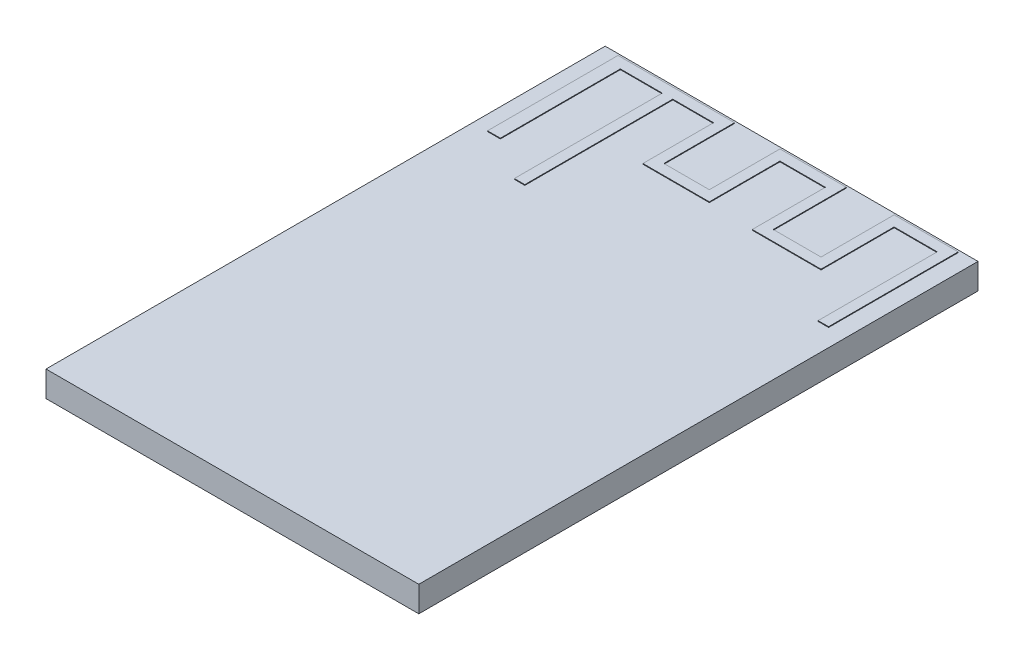
ISO-10303-21;
HEADER;
FILE_DESCRIPTION(('STEP AP214'),'2;1');
FILE_NAME('part.step','',(''),(''),'','','');
FILE_SCHEMA(('AUTOMOTIVE_DESIGN { 1 0 10303 214 1 1 1 1 }'));
ENDSEC;
DATA;
#1=APPLICATION_CONTEXT('core data for automotive mechanical design processes');
#2=APPLICATION_PROTOCOL_DEFINITION('international standard','automotive_design',2000,#1);
#3=PRODUCT_CONTEXT('',#1,'mechanical');
#4=PRODUCT('Part','Part','',(#3));
#5=PRODUCT_RELATED_PRODUCT_CATEGORY('part','',(#4));
#6=PRODUCT_DEFINITION_FORMATION('','',#4);
#7=PRODUCT_DEFINITION_CONTEXT('part definition',#1,'design');
#8=PRODUCT_DEFINITION('design','',#6,#7);
#9=PRODUCT_DEFINITION_SHAPE('','',#8);
#10=(LENGTH_UNIT() NAMED_UNIT(*) SI_UNIT(.MILLI.,.METRE.));
#11=(NAMED_UNIT(*) PLANE_ANGLE_UNIT() SI_UNIT($,.RADIAN.));
#12=(NAMED_UNIT(*) SI_UNIT($,.STERADIAN.) SOLID_ANGLE_UNIT());
#13=UNCERTAINTY_MEASURE_WITH_UNIT(LENGTH_MEASURE(1.E-05),#10,'distance_accuracy_value','');
#14=(GEOMETRIC_REPRESENTATION_CONTEXT(3) GLOBAL_UNCERTAINTY_ASSIGNED_CONTEXT((#13)) GLOBAL_UNIT_ASSIGNED_CONTEXT((#10,
#11,#12)) REPRESENTATION_CONTEXT('',''));
#15=CARTESIAN_POINT('',(0.,0.,0.));
#16=DIRECTION('',(0.,0.,1.));
#17=DIRECTION('',(1.,0.,0.));
#18=AXIS2_PLACEMENT_3D('',#15,#16,#17);
#19=CARTESIAN_POINT('',(0.,2.63,0.));
#20=DIRECTION('',(0.,-1.,0.));
#21=DIRECTION('',(0.,0.,-1.));
#22=AXIS2_PLACEMENT_3D('',#19,#20,#21);
#23=PLANE('',#22);
#24=DIRECTION('',(1.,0.,0.));
#25=VECTOR('',#24,1.);
#26=CARTESIAN_POINT('',(-19.7,2.63,-28.75));
#27=LINE('',#26,#25);
#28=CARTESIAN_POINT('',(-20.25,2.63,-28.75));
#29=VERTEX_POINT('',#28);
#30=CARTESIAN_POINT('',(-19.7,2.63,-28.75));
#31=VERTEX_POINT('',#30);
#32=EDGE_CURVE('E508',#29,#31,#27,.T.);
#33=ORIENTED_EDGE('',*,*,#32,.T.);
#34=DIRECTION('',(0.,0.,-1.));
#35=VECTOR('',#34,1.);
#36=CARTESIAN_POINT('',(-19.7,2.63,-33.9));
#37=LINE('',#36,#35);
#38=CARTESIAN_POINT('',(-19.7,2.63,-33.9));
#39=VERTEX_POINT('',#38);
#40=EDGE_CURVE('E305',#31,#39,#37,.T.);
#41=ORIENTED_EDGE('',*,*,#40,.T.);
#42=DIRECTION('',(1.,0.,0.));
#43=VECTOR('',#42,1.);
#44=CARTESIAN_POINT('',(-17.9,2.63,-33.9));
#45=LINE('',#44,#43);
#46=CARTESIAN_POINT('',(-17.9,2.63,-33.9));
#47=VERTEX_POINT('',#46);
#48=EDGE_CURVE('E300',#39,#47,#45,.T.);
#49=ORIENTED_EDGE('',*,*,#48,.T.);
#50=DIRECTION('',(0.,0.,1.));
#51=VECTOR('',#50,1.);
#52=CARTESIAN_POINT('',(-17.9,2.63,-27.55));
#53=LINE('',#52,#51);
#54=CARTESIAN_POINT('',(-17.9,2.63,-27.55));
#55=VERTEX_POINT('',#54);
#56=EDGE_CURVE('E466',#47,#55,#53,.T.);
#57=ORIENTED_EDGE('',*,*,#56,.T.);
#58=DIRECTION('',(1.,0.,0.));
#59=VECTOR('',#58,1.);
#60=CARTESIAN_POINT('',(-17.45,2.63,-27.55));
#61=LINE('',#60,#59);
#62=CARTESIAN_POINT('',(-17.45,2.63,-27.55));
#63=VERTEX_POINT('',#62);
#64=EDGE_CURVE('E537',#55,#63,#61,.T.);
#65=ORIENTED_EDGE('',*,*,#64,.T.);
#66=DIRECTION('',(0.,0.,-1.));
#67=VECTOR('',#66,1.);
#68=CARTESIAN_POINT('',(-17.45,2.63,-33.9));
#69=LINE('',#68,#67);
#70=CARTESIAN_POINT('',(-17.45,2.63,-33.9));
#71=VERTEX_POINT('',#70);
#72=EDGE_CURVE('E495',#63,#71,#69,.T.);
#73=ORIENTED_EDGE('',*,*,#72,.T.);
#74=DIRECTION('',(1.,0.,0.));
#75=VECTOR('',#74,1.);
#76=CARTESIAN_POINT('',(-15.7,2.63,-33.9));
#77=LINE('',#76,#75);
#78=CARTESIAN_POINT('',(-15.7,2.63,-33.9));
#79=VERTEX_POINT('',#78);
#80=EDGE_CURVE('E494',#71,#79,#77,.T.);
#81=ORIENTED_EDGE('',*,*,#80,.T.);
#82=DIRECTION('',(0.,0.,1.));
#83=VECTOR('',#82,1.);
#84=CARTESIAN_POINT('',(-15.7,2.63,-30.8694560140425));
#85=LINE('',#84,#83);
#86=CARTESIAN_POINT('',(-15.7,2.63,-30.8694560140425));
#87=VERTEX_POINT('',#86);
#88=EDGE_CURVE('E556',#79,#87,#85,.T.);
#89=ORIENTED_EDGE('',*,*,#88,.T.);
#90=DIRECTION('',(1.,0.,0.));
#91=VECTOR('',#90,1.);
#92=CARTESIAN_POINT('',(-12.85,2.63,-30.8694560140425));
#93=LINE('',#92,#91);
#94=CARTESIAN_POINT('',(-12.85,2.63,-30.8694560140425));
#95=VERTEX_POINT('',#94);
#96=EDGE_CURVE('E524',#87,#95,#93,.T.);
#97=ORIENTED_EDGE('',*,*,#96,.T.);
#98=DIRECTION('',(0.,0.,-1.));
#99=VECTOR('',#98,1.);
#100=CARTESIAN_POINT('',(-12.85,2.63,-33.9));
#101=LINE('',#100,#99);
#102=CARTESIAN_POINT('',(-12.85,2.63,-33.9));
#103=VERTEX_POINT('',#102);
#104=EDGE_CURVE('E502',#95,#103,#101,.T.);
#105=ORIENTED_EDGE('',*,*,#104,.T.);
#106=DIRECTION('',(1.,0.,0.));
#107=VECTOR('',#106,1.);
#108=CARTESIAN_POINT('',(-10.9,2.63,-33.9));
#109=LINE('',#108,#107);
#110=CARTESIAN_POINT('',(-10.9,2.63,-33.9));
#111=VERTEX_POINT('',#110);
#112=EDGE_CURVE('E575',#103,#111,#109,.T.);
#113=ORIENTED_EDGE('',*,*,#112,.T.);
#114=DIRECTION('',(0.,0.,1.));
#115=VECTOR('',#114,1.);
#116=CARTESIAN_POINT('',(-10.9,2.63,-30.762914186444));
#117=LINE('',#116,#115);
#118=CARTESIAN_POINT('',(-10.9,2.63,-30.762914186444));
#119=VERTEX_POINT('',#118);
#120=EDGE_CURVE('E442',#111,#119,#117,.T.);
#121=ORIENTED_EDGE('',*,*,#120,.T.);
#122=DIRECTION('',(1.,0.,0.));
#123=VECTOR('',#122,1.);
#124=CARTESIAN_POINT('',(-7.95,2.63,-30.762914186444));
#125=LINE('',#124,#123);
#126=CARTESIAN_POINT('',(-7.95,2.63,-30.762914186444));
#127=VERTEX_POINT('',#126);
#128=EDGE_CURVE('E501',#119,#127,#125,.T.);
#129=ORIENTED_EDGE('',*,*,#128,.T.);
#130=DIRECTION('',(0.,0.,-1.));
#131=VECTOR('',#130,1.);
#132=CARTESIAN_POINT('',(-7.95,2.63,-33.9));
#133=LINE('',#132,#131);
#134=CARTESIAN_POINT('',(-7.95,2.63,-33.9));
#135=VERTEX_POINT('',#134);
#136=EDGE_CURVE('E358',#127,#135,#133,.T.);
#137=ORIENTED_EDGE('',*,*,#136,.T.);
#138=DIRECTION('',(1.,0.,0.));
#139=VECTOR('',#138,1.);
#140=CARTESIAN_POINT('',(-6.1,2.63,-33.9));
#141=LINE('',#140,#139);
#142=CARTESIAN_POINT('',(-6.1,2.63,-33.9));
#143=VERTEX_POINT('',#142);
#144=EDGE_CURVE('E566',#135,#143,#141,.T.);
#145=ORIENTED_EDGE('',*,*,#144,.T.);
#146=DIRECTION('',(0.,0.,1.));
#147=VECTOR('',#146,1.);
#148=CARTESIAN_POINT('',(-6.1,2.63,-28.7874165665629));
#149=LINE('',#148,#147);
#150=CARTESIAN_POINT('',(-6.1,2.63,-28.7874165665629));
#151=VERTEX_POINT('',#150);
#152=EDGE_CURVE('E406',#143,#151,#149,.T.);
#153=ORIENTED_EDGE('',*,*,#152,.T.);
#154=DIRECTION('',(1.,0.,0.));
#155=VECTOR('',#154,1.);
#156=CARTESIAN_POINT('',(-5.65,2.63,-28.7874165665629));
#157=LINE('',#156,#155);
#158=CARTESIAN_POINT('',(-5.65,2.63,-28.7874165665629));
#159=VERTEX_POINT('',#158);
#160=EDGE_CURVE('E422',#151,#159,#157,.T.);
#161=ORIENTED_EDGE('',*,*,#160,.T.);
#162=DIRECTION('',(0.,0.,-1.));
#163=VECTOR('',#162,1.);
#164=CARTESIAN_POINT('',(-5.65,2.63,-34.35));
#165=LINE('',#164,#163);
#166=CARTESIAN_POINT('',(-5.65,2.63,-34.35));
#167=VERTEX_POINT('',#166);
#168=EDGE_CURVE('E485',#159,#167,#165,.T.);
#169=ORIENTED_EDGE('',*,*,#168,.T.);
#170=DIRECTION('',(-1.,0.,0.));
#171=VECTOR('',#170,1.);
#172=CARTESIAN_POINT('',(-8.4,2.63,-34.35));
#173=LINE('',#172,#171);
#174=CARTESIAN_POINT('',(-8.4,2.63,-34.35));
#175=VERTEX_POINT('',#174);
#176=EDGE_CURVE('E587',#167,#175,#173,.T.);
#177=ORIENTED_EDGE('',*,*,#176,.T.);
#178=DIRECTION('',(0.,0.,1.));
#179=VECTOR('',#178,1.);
#180=CARTESIAN_POINT('',(-8.4,2.63,-31.212914186444));
#181=LINE('',#180,#179);
#182=CARTESIAN_POINT('',(-8.4,2.63,-31.212914186444));
#183=VERTEX_POINT('',#182);
#184=EDGE_CURVE('E586',#175,#183,#181,.T.);
#185=ORIENTED_EDGE('',*,*,#184,.T.);
#186=DIRECTION('',(-1.,0.,0.));
#187=VECTOR('',#186,1.);
#188=CARTESIAN_POINT('',(-10.45,2.63,-31.212914186444));
#189=LINE('',#188,#187);
#190=CARTESIAN_POINT('',(-10.45,2.63,-31.212914186444));
#191=VERTEX_POINT('',#190);
#192=EDGE_CURVE('E345',#183,#191,#189,.T.);
#193=ORIENTED_EDGE('',*,*,#192,.T.);
#194=DIRECTION('',(0.,0.,-1.));
#195=VECTOR('',#194,1.);
#196=CARTESIAN_POINT('',(-10.45,2.63,-34.35));
#197=LINE('',#196,#195);
#198=CARTESIAN_POINT('',(-10.45,2.63,-34.35));
#199=VERTEX_POINT('',#198);
#200=EDGE_CURVE('E344',#191,#199,#197,.T.);
#201=ORIENTED_EDGE('',*,*,#200,.T.);
#202=DIRECTION('',(-1.,0.,0.));
#203=VECTOR('',#202,1.);
#204=CARTESIAN_POINT('',(-13.3,2.63,-34.35));
#205=LINE('',#204,#203);
#206=CARTESIAN_POINT('',(-13.3,2.63,-34.35));
#207=VERTEX_POINT('',#206);
#208=EDGE_CURVE('E519',#199,#207,#205,.T.);
#209=ORIENTED_EDGE('',*,*,#208,.T.);
#210=DIRECTION('',(0.,0.,1.));
#211=VECTOR('',#210,1.);
#212=CARTESIAN_POINT('',(-13.3,2.63,-31.3194560140425));
#213=LINE('',#212,#211);
#214=CARTESIAN_POINT('',(-13.3,2.63,-31.3194560140425));
#215=VERTEX_POINT('',#214);
#216=EDGE_CURVE('E548',#207,#215,#213,.T.);
#217=ORIENTED_EDGE('',*,*,#216,.T.);
#218=DIRECTION('',(-1.,0.,0.));
#219=VECTOR('',#218,1.);
#220=CARTESIAN_POINT('',(-15.25,2.63,-31.3194560140425));
#221=LINE('',#220,#219);
#222=CARTESIAN_POINT('',(-15.25,2.63,-31.3194560140425));
#223=VERTEX_POINT('',#222);
#224=EDGE_CURVE('E557',#215,#223,#221,.T.);
#225=ORIENTED_EDGE('',*,*,#224,.T.);
#226=DIRECTION('',(0.,0.,-1.));
#227=VECTOR('',#226,1.);
#228=CARTESIAN_POINT('',(-15.25,2.63,-34.35));
#229=LINE('',#228,#227);
#230=CARTESIAN_POINT('',(-15.25,2.63,-34.35));
#231=VERTEX_POINT('',#230);
#232=EDGE_CURVE('E484',#223,#231,#229,.T.);
#233=ORIENTED_EDGE('',*,*,#232,.T.);
#234=DIRECTION('',(-1.,0.,0.));
#235=VECTOR('',#234,1.);
#236=CARTESIAN_POINT('',(-20.25,2.63,-34.35));
#237=LINE('',#236,#235);
#238=CARTESIAN_POINT('',(-20.25,2.63,-34.35));
#239=VERTEX_POINT('',#238);
#240=EDGE_CURVE('E25',#231,#239,#237,.T.);
#241=ORIENTED_EDGE('',*,*,#240,.T.);
#242=DIRECTION('',(0.,0.,1.));
#243=VECTOR('',#242,1.);
#244=CARTESIAN_POINT('',(-20.25,2.63,-28.75));
#245=LINE('',#244,#243);
#246=EDGE_CURVE('E11',#239,#29,#245,.T.);
#247=ORIENTED_EDGE('',*,*,#246,.T.);
#248=EDGE_LOOP('',(#33,#41,#49,#57,#65,#73,#81,#89,#97,#105,#113,#121,#129,#137,#145,#153,#161,
#169,#177,#185,#193,#201,#209,#217,#225,#233,#241,#247));
#249=FACE_BOUND('',#248,.T.);
#250=ADVANCED_FACE('F17',(#249),#23,.F.);
#251=CARTESIAN_POINT('',(-20.25,2.63,-28.75));
#252=DIRECTION('',(1.,0.,0.));
#253=DIRECTION('',(0.,1.,0.));
#254=AXIS2_PLACEMENT_3D('',#251,#252,#253);
#255=PLANE('',#254);
#256=DIRECTION('',(0.,0.,1.));
#257=VECTOR('',#256,1.);
#258=CARTESIAN_POINT('',(-20.25,2.6,-28.75));
#259=LINE('',#258,#257);
#260=CARTESIAN_POINT('',(-20.25,2.6,-34.35));
#261=VERTEX_POINT('',#260);
#262=CARTESIAN_POINT('',(-20.25,2.6,-28.75));
#263=VERTEX_POINT('',#262);
#264=EDGE_CURVE('E333',#261,#263,#259,.T.);
#265=ORIENTED_EDGE('',*,*,#264,.T.);
#266=DIRECTION('',(0.,-1.,0.));
#267=VECTOR('',#266,1.);
#268=CARTESIAN_POINT('',(-20.25,2.63,-28.75));
#269=LINE('',#268,#267);
#270=EDGE_CURVE('E306',#29,#263,#269,.T.);
#271=ORIENTED_EDGE('',*,*,#270,.F.);
#272=ORIENTED_EDGE('',*,*,#246,.F.);
#273=DIRECTION('',(0.,-1.,0.));
#274=VECTOR('',#273,1.);
#275=CARTESIAN_POINT('',(-20.25,2.63,-34.35));
#276=LINE('',#275,#274);
#277=EDGE_CURVE('E462',#239,#261,#276,.T.);
#278=ORIENTED_EDGE('',*,*,#277,.T.);
#279=EDGE_LOOP('',(#265,#271,#272,#278));
#280=FACE_BOUND('',#279,.T.);
#281=ADVANCED_FACE('F729',(#280),#255,.F.);
#282=CARTESIAN_POINT('',(-20.25,2.63,-34.35));
#283=DIRECTION('',(0.,0.,1.));
#284=DIRECTION('',(1.,0.,0.));
#285=AXIS2_PLACEMENT_3D('',#282,#283,#284);
#286=PLANE('',#285);
#287=DIRECTION('',(-1.,0.,0.));
#288=VECTOR('',#287,1.);
#289=CARTESIAN_POINT('',(-20.25,2.6,-34.35));
#290=LINE('',#289,#288);
#291=CARTESIAN_POINT('',(-15.25,2.6,-34.35));
#292=VERTEX_POINT('',#291);
#293=EDGE_CURVE('E353',#292,#261,#290,.T.);
#294=ORIENTED_EDGE('',*,*,#293,.T.);
#295=ORIENTED_EDGE('',*,*,#277,.F.);
#296=ORIENTED_EDGE('',*,*,#240,.F.);
#297=DIRECTION('',(0.,-1.,0.));
#298=VECTOR('',#297,1.);
#299=CARTESIAN_POINT('',(-15.25,2.63,-34.35));
#300=LINE('',#299,#298);
#301=EDGE_CURVE('E561',#231,#292,#300,.T.);
#302=ORIENTED_EDGE('',*,*,#301,.T.);
#303=EDGE_LOOP('',(#294,#295,#296,#302));
#304=FACE_BOUND('',#303,.T.);
#305=ADVANCED_FACE('F734',(#304),#286,.F.);
#306=CARTESIAN_POINT('',(-15.25,2.63,-34.35));
#307=DIRECTION('',(-1.,0.,0.));
#308=DIRECTION('',(0.,0.,1.));
#309=AXIS2_PLACEMENT_3D('',#306,#307,#308);
#310=PLANE('',#309);
#311=DIRECTION('',(0.,0.,-1.));
#312=VECTOR('',#311,1.);
#313=CARTESIAN_POINT('',(-15.25,2.6,-34.35));
#314=LINE('',#313,#312);
#315=CARTESIAN_POINT('',(-15.25,2.6,-31.3194560140425));
#316=VERTEX_POINT('',#315);
#317=EDGE_CURVE('E357',#316,#292,#314,.T.);
#318=ORIENTED_EDGE('',*,*,#317,.T.);
#319=ORIENTED_EDGE('',*,*,#301,.F.);
#320=ORIENTED_EDGE('',*,*,#232,.F.);
#321=DIRECTION('',(0.,-1.,0.));
#322=VECTOR('',#321,1.);
#323=CARTESIAN_POINT('',(-15.25,2.63,-31.3194560140425));
#324=LINE('',#323,#322);
#325=EDGE_CURVE('E552',#223,#316,#324,.T.);
#326=ORIENTED_EDGE('',*,*,#325,.T.);
#327=EDGE_LOOP('',(#318,#319,#320,#326));
#328=FACE_BOUND('',#327,.T.);
#329=ADVANCED_FACE('F740',(#328),#310,.F.);
#330=CARTESIAN_POINT('',(-15.25,2.63,-31.3194560140425));
#331=DIRECTION('',(0.,0.,1.));
#332=DIRECTION('',(1.,0.,0.));
#333=AXIS2_PLACEMENT_3D('',#330,#331,#332);
#334=PLANE('',#333);
#335=DIRECTION('',(-1.,0.,0.));
#336=VECTOR('',#335,1.);
#337=CARTESIAN_POINT('',(-15.25,2.6,-31.3194560140425));
#338=LINE('',#337,#336);
#339=CARTESIAN_POINT('',(-13.3,2.6,-31.3194560140425));
#340=VERTEX_POINT('',#339);
#341=EDGE_CURVE('E367',#340,#316,#338,.T.);
#342=ORIENTED_EDGE('',*,*,#341,.T.);
#343=ORIENTED_EDGE('',*,*,#325,.F.);
#344=ORIENTED_EDGE('',*,*,#224,.F.);
#345=DIRECTION('',(0.,-1.,0.));
#346=VECTOR('',#345,1.);
#347=CARTESIAN_POINT('',(-13.3,2.63,-31.3194560140425));
#348=LINE('',#347,#346);
#349=EDGE_CURVE('E553',#215,#340,#348,.T.);
#350=ORIENTED_EDGE('',*,*,#349,.T.);
#351=EDGE_LOOP('',(#342,#343,#344,#350));
#352=FACE_BOUND('',#351,.T.);
#353=ADVANCED_FACE('F757',(#352),#334,.F.);
#354=CARTESIAN_POINT('',(-13.3,2.63,-31.3194560140425));
#355=DIRECTION('',(1.,0.,0.));
#356=DIRECTION('',(0.,1.,0.));
#357=AXIS2_PLACEMENT_3D('',#354,#355,#356);
#358=PLANE('',#357);
#359=DIRECTION('',(0.,0.,1.));
#360=VECTOR('',#359,1.);
#361=CARTESIAN_POINT('',(-13.3,2.6,-31.3194560140425));
#362=LINE('',#361,#360);
#363=CARTESIAN_POINT('',(-13.3,2.6,-34.35));
#364=VERTEX_POINT('',#363);
#365=EDGE_CURVE('E377',#364,#340,#362,.T.);
#366=ORIENTED_EDGE('',*,*,#365,.T.);
#367=ORIENTED_EDGE('',*,*,#349,.F.);
#368=ORIENTED_EDGE('',*,*,#216,.F.);
#369=DIRECTION('',(0.,-1.,0.));
#370=VECTOR('',#369,1.);
#371=CARTESIAN_POINT('',(-13.3,2.63,-34.35));
#372=LINE('',#371,#370);
#373=EDGE_CURVE('E516',#207,#364,#372,.T.);
#374=ORIENTED_EDGE('',*,*,#373,.T.);
#375=EDGE_LOOP('',(#366,#367,#368,#374));
#376=FACE_BOUND('',#375,.T.);
#377=ADVANCED_FACE('F753',(#376),#358,.F.);
#378=CARTESIAN_POINT('',(-13.3,2.63,-34.35));
#379=DIRECTION('',(0.,0.,1.));
#380=DIRECTION('',(1.,0.,0.));
#381=AXIS2_PLACEMENT_3D('',#378,#379,#380);
#382=PLANE('',#381);
#383=DIRECTION('',(-1.,0.,0.));
#384=VECTOR('',#383,1.);
#385=CARTESIAN_POINT('',(-13.3,2.6,-34.35));
#386=LINE('',#385,#384);
#387=CARTESIAN_POINT('',(-10.45,2.6,-34.35));
#388=VERTEX_POINT('',#387);
#389=EDGE_CURVE('E381',#388,#364,#386,.T.);
#390=ORIENTED_EDGE('',*,*,#389,.T.);
#391=ORIENTED_EDGE('',*,*,#373,.F.);
#392=ORIENTED_EDGE('',*,*,#208,.F.);
#393=DIRECTION('',(0.,-1.,0.));
#394=VECTOR('',#393,1.);
#395=CARTESIAN_POINT('',(-10.45,2.63,-34.35));
#396=LINE('',#395,#394);
#397=EDGE_CURVE('E342',#199,#388,#396,.T.);
#398=ORIENTED_EDGE('',*,*,#397,.T.);
#399=EDGE_LOOP('',(#390,#391,#392,#398));
#400=FACE_BOUND('',#399,.T.);
#401=ADVANCED_FACE('F749',(#400),#382,.F.);
#402=CARTESIAN_POINT('',(-10.45,2.63,-34.35));
#403=DIRECTION('',(-1.,0.,0.));
#404=DIRECTION('',(0.,0.,1.));
#405=AXIS2_PLACEMENT_3D('',#402,#403,#404);
#406=PLANE('',#405);
#407=DIRECTION('',(0.,0.,-1.));
#408=VECTOR('',#407,1.);
#409=CARTESIAN_POINT('',(-10.45,2.6,-34.35));
#410=LINE('',#409,#408);
#411=CARTESIAN_POINT('',(-10.45,2.6,-31.212914186444));
#412=VERTEX_POINT('',#411);
#413=EDGE_CURVE('E386',#412,#388,#410,.T.);
#414=ORIENTED_EDGE('',*,*,#413,.T.);
#415=ORIENTED_EDGE('',*,*,#397,.F.);
#416=ORIENTED_EDGE('',*,*,#200,.F.);
#417=DIRECTION('',(0.,-1.,0.));
#418=VECTOR('',#417,1.);
#419=CARTESIAN_POINT('',(-10.45,2.63,-31.212914186444));
#420=LINE('',#419,#418);
#421=EDGE_CURVE('E607',#191,#412,#420,.T.);
#422=ORIENTED_EDGE('',*,*,#421,.T.);
#423=EDGE_LOOP('',(#414,#415,#416,#422));
#424=FACE_BOUND('',#423,.T.);
#425=ADVANCED_FACE('F746',(#424),#406,.F.);
#426=CARTESIAN_POINT('',(-10.45,2.63,-31.212914186444));
#427=DIRECTION('',(0.,0.,1.));
#428=DIRECTION('',(1.,0.,0.));
#429=AXIS2_PLACEMENT_3D('',#426,#427,#428);
#430=PLANE('',#429);
#431=DIRECTION('',(-1.,0.,0.));
#432=VECTOR('',#431,1.);
#433=CARTESIAN_POINT('',(-10.45,2.6,-31.212914186444));
#434=LINE('',#433,#432);
#435=CARTESIAN_POINT('',(-8.4,2.6,-31.212914186444));
#436=VERTEX_POINT('',#435);
#437=EDGE_CURVE('E382',#436,#412,#434,.T.);
#438=ORIENTED_EDGE('',*,*,#437,.T.);
#439=ORIENTED_EDGE('',*,*,#421,.F.);
#440=ORIENTED_EDGE('',*,*,#192,.F.);
#441=DIRECTION('',(0.,-1.,0.));
#442=VECTOR('',#441,1.);
#443=CARTESIAN_POINT('',(-8.4,2.63,-31.212914186444));
#444=LINE('',#443,#442);
#445=EDGE_CURVE('E583',#183,#436,#444,.T.);
#446=ORIENTED_EDGE('',*,*,#445,.T.);
#447=EDGE_LOOP('',(#438,#439,#440,#446));
#448=FACE_BOUND('',#447,.T.);
#449=ADVANCED_FACE('F744',(#448),#430,.F.);
#450=CARTESIAN_POINT('',(-8.4,2.63,-31.212914186444));
#451=DIRECTION('',(1.,0.,0.));
#452=DIRECTION('',(0.,1.,0.));
#453=AXIS2_PLACEMENT_3D('',#450,#451,#452);
#454=PLANE('',#453);
#455=DIRECTION('',(0.,0.,1.));
#456=VECTOR('',#455,1.);
#457=CARTESIAN_POINT('',(-8.4,2.6,-31.212914186444));
#458=LINE('',#457,#456);
#459=CARTESIAN_POINT('',(-8.4,2.6,-34.35));
#460=VERTEX_POINT('',#459);
#461=EDGE_CURVE('E373',#460,#436,#458,.T.);
#462=ORIENTED_EDGE('',*,*,#461,.T.);
#463=ORIENTED_EDGE('',*,*,#445,.F.);
#464=ORIENTED_EDGE('',*,*,#184,.F.);
#465=DIRECTION('',(0.,-1.,0.));
#466=VECTOR('',#465,1.);
#467=CARTESIAN_POINT('',(-8.4,2.63,-34.35));
#468=LINE('',#467,#466);
#469=EDGE_CURVE('E489',#175,#460,#468,.T.);
#470=ORIENTED_EDGE('',*,*,#469,.T.);
#471=EDGE_LOOP('',(#462,#463,#464,#470));
#472=FACE_BOUND('',#471,.T.);
#473=ADVANCED_FACE('F781',(#472),#454,.F.);
#474=CARTESIAN_POINT('',(-8.4,2.63,-34.35));
#475=DIRECTION('',(0.,0.,1.));
#476=DIRECTION('',(1.,0.,0.));
#477=AXIS2_PLACEMENT_3D('',#474,#475,#476);
#478=PLANE('',#477);
#479=DIRECTION('',(-1.,0.,0.));
#480=VECTOR('',#479,1.);
#481=CARTESIAN_POINT('',(-8.4,2.6,-34.35));
#482=LINE('',#481,#480);
#483=CARTESIAN_POINT('',(-5.65,2.6,-34.35));
#484=VERTEX_POINT('',#483);
#485=EDGE_CURVE('E368',#484,#460,#482,.T.);
#486=ORIENTED_EDGE('',*,*,#485,.T.);
#487=ORIENTED_EDGE('',*,*,#469,.F.);
#488=ORIENTED_EDGE('',*,*,#176,.F.);
#489=DIRECTION('',(0.,-1.,0.));
#490=VECTOR('',#489,1.);
#491=CARTESIAN_POINT('',(-5.65,2.63,-34.35));
#492=LINE('',#491,#490);
#493=EDGE_CURVE('E490',#167,#484,#492,.T.);
#494=ORIENTED_EDGE('',*,*,#493,.T.);
#495=EDGE_LOOP('',(#486,#487,#488,#494));
#496=FACE_BOUND('',#495,.T.);
#497=ADVANCED_FACE('F1213',(#496),#478,.F.);
#498=CARTESIAN_POINT('',(-5.65,2.63,-34.35));
#499=DIRECTION('',(-1.,0.,0.));
#500=DIRECTION('',(0.,1.,0.));
#501=AXIS2_PLACEMENT_3D('',#498,#499,#500);
#502=PLANE('',#501);
#503=DIRECTION('',(0.,0.,-1.));
#504=VECTOR('',#503,1.);
#505=CARTESIAN_POINT('',(-5.65,2.6,-34.35));
#506=LINE('',#505,#504);
#507=CARTESIAN_POINT('',(-5.65,2.6,-28.7874165665629));
#508=VERTEX_POINT('',#507);
#509=EDGE_CURVE('E372',#508,#484,#506,.T.);
#510=ORIENTED_EDGE('',*,*,#509,.T.);
#511=ORIENTED_EDGE('',*,*,#493,.F.);
#512=ORIENTED_EDGE('',*,*,#168,.F.);
#513=DIRECTION('',(0.,-1.,0.));
#514=VECTOR('',#513,1.);
#515=CARTESIAN_POINT('',(-5.65,2.63,-28.7874165665629));
#516=LINE('',#515,#514);
#517=EDGE_CURVE('E410',#159,#508,#516,.T.);
#518=ORIENTED_EDGE('',*,*,#517,.T.);
#519=EDGE_LOOP('',(#510,#511,#512,#518));
#520=FACE_BOUND('',#519,.T.);
#521=ADVANCED_FACE('F1204',(#520),#502,.F.);
#522=CARTESIAN_POINT('',(-5.65,2.63,-28.7874165665629));
#523=DIRECTION('',(0.,0.,-1.));
#524=DIRECTION('',(0.,-1.,0.));
#525=AXIS2_PLACEMENT_3D('',#522,#523,#524);
#526=PLANE('',#525);
#527=DIRECTION('',(1.,0.,0.));
#528=VECTOR('',#527,1.);
#529=CARTESIAN_POINT('',(-5.65,2.6,-28.7874165665629));
#530=LINE('',#529,#528);
#531=CARTESIAN_POINT('',(-6.1,2.6,-28.7874165665629));
#532=VERTEX_POINT('',#531);
#533=EDGE_CURVE('E390',#532,#508,#530,.T.);
#534=ORIENTED_EDGE('',*,*,#533,.T.);
#535=ORIENTED_EDGE('',*,*,#517,.F.);
#536=ORIENTED_EDGE('',*,*,#160,.F.);
#537=DIRECTION('',(0.,-1.,0.));
#538=VECTOR('',#537,1.);
#539=CARTESIAN_POINT('',(-6.1,2.63,-28.7874165665629));
#540=LINE('',#539,#538);
#541=EDGE_CURVE('E411',#151,#532,#540,.T.);
#542=ORIENTED_EDGE('',*,*,#541,.T.);
#543=EDGE_LOOP('',(#534,#535,#536,#542));
#544=FACE_BOUND('',#543,.T.);
#545=ADVANCED_FACE('F1195',(#544),#526,.F.);
#546=CARTESIAN_POINT('',(-6.1,2.63,-28.7874165665629));
#547=DIRECTION('',(1.,0.,0.));
#548=DIRECTION('',(0.,1.,0.));
#549=AXIS2_PLACEMENT_3D('',#546,#547,#548);
#550=PLANE('',#549);
#551=DIRECTION('',(0.,0.,1.));
#552=VECTOR('',#551,1.);
#553=CARTESIAN_POINT('',(-6.1,2.6,-28.7874165665629));
#554=LINE('',#553,#552);
#555=CARTESIAN_POINT('',(-6.1,2.6,-33.9));
#556=VERTEX_POINT('',#555);
#557=EDGE_CURVE('E397',#556,#532,#554,.T.);
#558=ORIENTED_EDGE('',*,*,#557,.T.);
#559=ORIENTED_EDGE('',*,*,#541,.F.);
#560=ORIENTED_EDGE('',*,*,#152,.F.);
#561=DIRECTION('',(0.,-1.,0.));
#562=VECTOR('',#561,1.);
#563=CARTESIAN_POINT('',(-6.1,2.63,-33.9));
#564=LINE('',#563,#562);
#565=EDGE_CURVE('E362',#143,#556,#564,.T.);
#566=ORIENTED_EDGE('',*,*,#565,.T.);
#567=EDGE_LOOP('',(#558,#559,#560,#566));
#568=FACE_BOUND('',#567,.T.);
#569=ADVANCED_FACE('F1186',(#568),#550,.F.);
#570=CARTESIAN_POINT('',(-6.1,2.63,-33.9));
#571=DIRECTION('',(0.,0.,-1.));
#572=DIRECTION('',(0.,-1.,0.));
#573=AXIS2_PLACEMENT_3D('',#570,#571,#572);
#574=PLANE('',#573);
#575=DIRECTION('',(1.,0.,0.));
#576=VECTOR('',#575,1.);
#577=CARTESIAN_POINT('',(-6.1,2.6,-33.9));
#578=LINE('',#577,#576);
#579=CARTESIAN_POINT('',(-7.95,2.6,-33.9));
#580=VERTEX_POINT('',#579);
#581=EDGE_CURVE('E401',#580,#556,#578,.T.);
#582=ORIENTED_EDGE('',*,*,#581,.T.);
#583=ORIENTED_EDGE('',*,*,#565,.F.);
#584=ORIENTED_EDGE('',*,*,#144,.F.);
#585=DIRECTION('',(0.,-1.,0.));
#586=VECTOR('',#585,1.);
#587=CARTESIAN_POINT('',(-7.95,2.63,-33.9));
#588=LINE('',#587,#586);
#589=EDGE_CURVE('E363',#135,#580,#588,.T.);
#590=ORIENTED_EDGE('',*,*,#589,.T.);
#591=EDGE_LOOP('',(#582,#583,#584,#590));
#592=FACE_BOUND('',#591,.T.);
#593=ADVANCED_FACE('F1177',(#592),#574,.F.);
#594=CARTESIAN_POINT('',(-7.95,2.63,-33.9));
#595=DIRECTION('',(-1.,0.,0.));
#596=DIRECTION('',(0.,0.,1.));
#597=AXIS2_PLACEMENT_3D('',#594,#595,#596);
#598=PLANE('',#597);
#599=DIRECTION('',(0.,0.,-1.));
#600=VECTOR('',#599,1.);
#601=CARTESIAN_POINT('',(-7.95,2.6,-33.9));
#602=LINE('',#601,#600);
#603=CARTESIAN_POINT('',(-7.95,2.6,-30.762914186444));
#604=VERTEX_POINT('',#603);
#605=EDGE_CURVE('E405',#604,#580,#602,.T.);
#606=ORIENTED_EDGE('',*,*,#605,.T.);
#607=ORIENTED_EDGE('',*,*,#589,.F.);
#608=ORIENTED_EDGE('',*,*,#136,.F.);
#609=DIRECTION('',(0.,-1.,0.));
#610=VECTOR('',#609,1.);
#611=CARTESIAN_POINT('',(-7.95,2.63,-30.762914186444));
#612=LINE('',#611,#610);
#613=EDGE_CURVE('E446',#127,#604,#612,.T.);
#614=ORIENTED_EDGE('',*,*,#613,.T.);
#615=EDGE_LOOP('',(#606,#607,#608,#614));
#616=FACE_BOUND('',#615,.T.);
#617=ADVANCED_FACE('F1168',(#616),#598,.F.);
#618=CARTESIAN_POINT('',(-7.95,2.63,-30.762914186444));
#619=DIRECTION('',(0.,0.,-1.));
#620=DIRECTION('',(0.,-1.,0.));
#621=AXIS2_PLACEMENT_3D('',#618,#619,#620);
#622=PLANE('',#621);
#623=DIRECTION('',(1.,0.,0.));
#624=VECTOR('',#623,1.);
#625=CARTESIAN_POINT('',(-7.95,2.6,-30.762914186444));
#626=LINE('',#625,#624);
#627=CARTESIAN_POINT('',(-10.9,2.6,-30.762914186444));
#628=VERTEX_POINT('',#627);
#629=EDGE_CURVE('E340',#628,#604,#626,.T.);
#630=ORIENTED_EDGE('',*,*,#629,.T.);
#631=ORIENTED_EDGE('',*,*,#613,.F.);
#632=ORIENTED_EDGE('',*,*,#128,.F.);
#633=DIRECTION('',(0.,-1.,0.));
#634=VECTOR('',#633,1.);
#635=CARTESIAN_POINT('',(-10.9,2.63,-30.762914186444));
#636=LINE('',#635,#634);
#637=EDGE_CURVE('E447',#119,#628,#636,.T.);
#638=ORIENTED_EDGE('',*,*,#637,.T.);
#639=EDGE_LOOP('',(#630,#631,#632,#638));
#640=FACE_BOUND('',#639,.T.);
#641=ADVANCED_FACE('F1159',(#640),#622,.F.);
#642=CARTESIAN_POINT('',(-10.9,2.63,-30.762914186444));
#643=DIRECTION('',(1.,0.,0.));
#644=DIRECTION('',(0.,1.,0.));
#645=AXIS2_PLACEMENT_3D('',#642,#643,#644);
#646=PLANE('',#645);
#647=DIRECTION('',(0.,0.,1.));
#648=VECTOR('',#647,1.);
#649=CARTESIAN_POINT('',(-10.9,2.6,-30.762914186444));
#650=LINE('',#649,#648);
#651=CARTESIAN_POINT('',(-10.9,2.6,-33.9));
#652=VERTEX_POINT('',#651);
#653=EDGE_CURVE('E415',#652,#628,#650,.T.);
#654=ORIENTED_EDGE('',*,*,#653,.T.);
#655=ORIENTED_EDGE('',*,*,#637,.F.);
#656=ORIENTED_EDGE('',*,*,#120,.F.);
#657=DIRECTION('',(0.,-1.,0.));
#658=VECTOR('',#657,1.);
#659=CARTESIAN_POINT('',(-10.9,2.63,-33.9));
#660=LINE('',#659,#658);
#661=EDGE_CURVE('E506',#111,#652,#660,.T.);
#662=ORIENTED_EDGE('',*,*,#661,.T.);
#663=EDGE_LOOP('',(#654,#655,#656,#662));
#664=FACE_BOUND('',#663,.T.);
#665=ADVANCED_FACE('F1151',(#664),#646,.F.);
#666=CARTESIAN_POINT('',(-10.9,2.63,-33.9));
#667=DIRECTION('',(0.,0.,-1.));
#668=DIRECTION('',(0.,-1.,0.));
#669=AXIS2_PLACEMENT_3D('',#666,#667,#668);
#670=PLANE('',#669);
#671=DIRECTION('',(1.,0.,0.));
#672=VECTOR('',#671,1.);
#673=CARTESIAN_POINT('',(-10.9,2.6,-33.9));
#674=LINE('',#673,#672);
#675=CARTESIAN_POINT('',(-12.85,2.6,-33.9));
#676=VERTEX_POINT('',#675);
#677=EDGE_CURVE('E419',#676,#652,#674,.T.);
#678=ORIENTED_EDGE('',*,*,#677,.T.);
#679=ORIENTED_EDGE('',*,*,#661,.F.);
#680=ORIENTED_EDGE('',*,*,#112,.F.);
#681=DIRECTION('',(0.,-1.,0.));
#682=VECTOR('',#681,1.);
#683=CARTESIAN_POINT('',(-12.85,2.63,-33.9));
#684=LINE('',#683,#682);
#685=EDGE_CURVE('E507',#103,#676,#684,.T.);
#686=ORIENTED_EDGE('',*,*,#685,.T.);
#687=EDGE_LOOP('',(#678,#679,#680,#686));
#688=FACE_BOUND('',#687,.T.);
#689=ADVANCED_FACE('F659',(#688),#670,.F.);
#690=CARTESIAN_POINT('',(-12.85,2.63,-33.9));
#691=DIRECTION('',(-1.,0.,0.));
#692=DIRECTION('',(0.,0.,1.));
#693=AXIS2_PLACEMENT_3D('',#690,#691,#692);
#694=PLANE('',#693);
#695=DIRECTION('',(0.,0.,-1.));
#696=VECTOR('',#695,1.);
#697=CARTESIAN_POINT('',(-12.85,2.6,-33.9));
#698=LINE('',#697,#696);
#699=CARTESIAN_POINT('',(-12.85,2.6,-30.8694560140425));
#700=VERTEX_POINT('',#699);
#701=EDGE_CURVE('E426',#700,#676,#698,.T.);
#702=ORIENTED_EDGE('',*,*,#701,.T.);
#703=ORIENTED_EDGE('',*,*,#685,.F.);
#704=ORIENTED_EDGE('',*,*,#104,.F.);
#705=DIRECTION('',(0.,-1.,0.));
#706=VECTOR('',#705,1.);
#707=CARTESIAN_POINT('',(-12.85,2.63,-30.8694560140425));
#708=LINE('',#707,#706);
#709=EDGE_CURVE('E565',#95,#700,#708,.T.);
#710=ORIENTED_EDGE('',*,*,#709,.T.);
#711=EDGE_LOOP('',(#702,#703,#704,#710));
#712=FACE_BOUND('',#711,.T.);
#713=ADVANCED_FACE('F646',(#712),#694,.F.);
#714=CARTESIAN_POINT('',(-12.85,2.63,-30.8694560140425));
#715=DIRECTION('',(0.,0.,-1.));
#716=DIRECTION('',(-1.,0.,0.));
#717=AXIS2_PLACEMENT_3D('',#714,#715,#716);
#718=PLANE('',#717);
#719=DIRECTION('',(1.,0.,0.));
#720=VECTOR('',#719,1.);
#721=CARTESIAN_POINT('',(-12.85,2.6,-30.8694560140425));
#722=LINE('',#721,#720);
#723=CARTESIAN_POINT('',(-15.7,2.6,-30.8694560140425));
#724=VERTEX_POINT('',#723);
#725=EDGE_CURVE('E433',#724,#700,#722,.T.);
#726=ORIENTED_EDGE('',*,*,#725,.T.);
#727=ORIENTED_EDGE('',*,*,#709,.F.);
#728=ORIENTED_EDGE('',*,*,#96,.F.);
#729=DIRECTION('',(0.,-1.,0.));
#730=VECTOR('',#729,1.);
#731=CARTESIAN_POINT('',(-15.7,2.63,-30.8694560140425));
#732=LINE('',#731,#730);
#733=EDGE_CURVE('E547',#87,#724,#732,.T.);
#734=ORIENTED_EDGE('',*,*,#733,.T.);
#735=EDGE_LOOP('',(#726,#727,#728,#734));
#736=FACE_BOUND('',#735,.T.);
#737=ADVANCED_FACE('F652',(#736),#718,.F.);
#738=CARTESIAN_POINT('',(-15.7,2.63,-30.8694560140425));
#739=DIRECTION('',(1.,0.,0.));
#740=DIRECTION('',(0.,1.,0.));
#741=AXIS2_PLACEMENT_3D('',#738,#739,#740);
#742=PLANE('',#741);
#743=DIRECTION('',(0.,0.,1.));
#744=VECTOR('',#743,1.);
#745=CARTESIAN_POINT('',(-15.7,2.6,-30.8694560140425));
#746=LINE('',#745,#744);
#747=CARTESIAN_POINT('',(-15.7,2.6,-33.9));
#748=VERTEX_POINT('',#747);
#749=EDGE_CURVE('E441',#748,#724,#746,.T.);
#750=ORIENTED_EDGE('',*,*,#749,.T.);
#751=ORIENTED_EDGE('',*,*,#733,.F.);
#752=ORIENTED_EDGE('',*,*,#88,.F.);
#753=DIRECTION('',(0.,-1.,0.));
#754=VECTOR('',#753,1.);
#755=CARTESIAN_POINT('',(-15.7,2.63,-33.9));
#756=LINE('',#755,#754);
#757=EDGE_CURVE('E491',#79,#748,#756,.T.);
#758=ORIENTED_EDGE('',*,*,#757,.T.);
#759=EDGE_LOOP('',(#750,#751,#752,#758));
#760=FACE_BOUND('',#759,.T.);
#761=ADVANCED_FACE('F662',(#760),#742,.F.);
#762=CARTESIAN_POINT('',(-15.7,2.63,-33.9));
#763=DIRECTION('',(0.,0.,-1.));
#764=DIRECTION('',(0.,-1.,0.));
#765=AXIS2_PLACEMENT_3D('',#762,#763,#764);
#766=PLANE('',#765);
#767=DIRECTION('',(1.,0.,0.));
#768=VECTOR('',#767,1.);
#769=CARTESIAN_POINT('',(-15.7,2.6,-33.9));
#770=LINE('',#769,#768);
#771=CARTESIAN_POINT('',(-17.45,2.6,-33.9));
#772=VERTEX_POINT('',#771);
#773=EDGE_CURVE('E451',#772,#748,#770,.T.);
#774=ORIENTED_EDGE('',*,*,#773,.T.);
#775=ORIENTED_EDGE('',*,*,#757,.F.);
#776=ORIENTED_EDGE('',*,*,#80,.F.);
#777=DIRECTION('',(0.,-1.,0.));
#778=VECTOR('',#777,1.);
#779=CARTESIAN_POINT('',(-17.45,2.63,-33.9));
#780=LINE('',#779,#778);
#781=EDGE_CURVE('E538',#71,#772,#780,.T.);
#782=ORIENTED_EDGE('',*,*,#781,.T.);
#783=EDGE_LOOP('',(#774,#775,#776,#782));
#784=FACE_BOUND('',#783,.T.);
#785=ADVANCED_FACE('F666',(#784),#766,.F.);
#786=CARTESIAN_POINT('',(-17.45,2.63,-33.9));
#787=DIRECTION('',(-1.,0.,0.));
#788=DIRECTION('',(0.,0.,1.));
#789=AXIS2_PLACEMENT_3D('',#786,#787,#788);
#790=PLANE('',#789);
#791=DIRECTION('',(0.,0.,-1.));
#792=VECTOR('',#791,1.);
#793=CARTESIAN_POINT('',(-17.45,2.6,-33.9));
#794=LINE('',#793,#792);
#795=CARTESIAN_POINT('',(-17.45,2.6,-27.55));
#796=VERTEX_POINT('',#795);
#797=EDGE_CURVE('E459',#796,#772,#794,.T.);
#798=ORIENTED_EDGE('',*,*,#797,.T.);
#799=ORIENTED_EDGE('',*,*,#781,.F.);
#800=ORIENTED_EDGE('',*,*,#72,.F.);
#801=DIRECTION('',(0.,-1.,0.));
#802=VECTOR('',#801,1.);
#803=CARTESIAN_POINT('',(-17.45,2.63,-27.55));
#804=LINE('',#803,#802);
#805=EDGE_CURVE('E470',#63,#796,#804,.T.);
#806=ORIENTED_EDGE('',*,*,#805,.T.);
#807=EDGE_LOOP('',(#798,#799,#800,#806));
#808=FACE_BOUND('',#807,.T.);
#809=ADVANCED_FACE('F669',(#808),#790,.F.);
#810=CARTESIAN_POINT('',(-17.45,2.63,-27.55));
#811=DIRECTION('',(0.,0.,-1.));
#812=DIRECTION('',(0.,-1.,0.));
#813=AXIS2_PLACEMENT_3D('',#810,#811,#812);
#814=PLANE('',#813);
#815=DIRECTION('',(1.,0.,0.));
#816=VECTOR('',#815,1.);
#817=CARTESIAN_POINT('',(-17.45,2.6,-27.55));
#818=LINE('',#817,#816);
#819=CARTESIAN_POINT('',(-17.9,2.6,-27.55));
#820=VERTEX_POINT('',#819);
#821=EDGE_CURVE('E429',#820,#796,#818,.T.);
#822=ORIENTED_EDGE('',*,*,#821,.T.);
#823=ORIENTED_EDGE('',*,*,#805,.F.);
#824=ORIENTED_EDGE('',*,*,#64,.F.);
#825=DIRECTION('',(0.,-1.,0.));
#826=VECTOR('',#825,1.);
#827=CARTESIAN_POINT('',(-17.9,2.63,-27.55));
#828=LINE('',#827,#826);
#829=EDGE_CURVE('E471',#55,#820,#828,.T.);
#830=ORIENTED_EDGE('',*,*,#829,.T.);
#831=EDGE_LOOP('',(#822,#823,#824,#830));
#832=FACE_BOUND('',#831,.T.);
#833=ADVANCED_FACE('F672',(#832),#814,.F.);
#834=CARTESIAN_POINT('',(-17.9,2.63,-27.55));
#835=DIRECTION('',(1.,0.,0.));
#836=DIRECTION('',(0.,1.,0.));
#837=AXIS2_PLACEMENT_3D('',#834,#835,#836);
#838=PLANE('',#837);
#839=DIRECTION('',(0.,0.,1.));
#840=VECTOR('',#839,1.);
#841=CARTESIAN_POINT('',(-17.9,2.6,-27.55));
#842=LINE('',#841,#840);
#843=CARTESIAN_POINT('',(-17.9,2.6,-33.9));
#844=VERTEX_POINT('',#843);
#845=EDGE_CURVE('E316',#844,#820,#842,.T.);
#846=ORIENTED_EDGE('',*,*,#845,.T.);
#847=ORIENTED_EDGE('',*,*,#829,.F.);
#848=ORIENTED_EDGE('',*,*,#56,.F.);
#849=DIRECTION('',(0.,-1.,0.));
#850=VECTOR('',#849,1.);
#851=CARTESIAN_POINT('',(-17.9,2.63,-33.9));
#852=LINE('',#851,#850);
#853=EDGE_CURVE('E393',#47,#844,#852,.T.);
#854=ORIENTED_EDGE('',*,*,#853,.T.);
#855=EDGE_LOOP('',(#846,#847,#848,#854));
#856=FACE_BOUND('',#855,.T.);
#857=ADVANCED_FACE('F675',(#856),#838,.F.);
#858=CARTESIAN_POINT('',(-17.9,2.63,-33.9));
#859=DIRECTION('',(0.,0.,-1.));
#860=DIRECTION('',(0.,-1.,0.));
#861=AXIS2_PLACEMENT_3D('',#858,#859,#860);
#862=PLANE('',#861);
#863=DIRECTION('',(1.,0.,0.));
#864=VECTOR('',#863,1.);
#865=CARTESIAN_POINT('',(-17.9,2.6,-33.9));
#866=LINE('',#865,#864);
#867=CARTESIAN_POINT('',(-19.7,2.6,-33.9));
#868=VERTEX_POINT('',#867);
#869=EDGE_CURVE('E297',#868,#844,#866,.T.);
#870=ORIENTED_EDGE('',*,*,#869,.T.);
#871=ORIENTED_EDGE('',*,*,#853,.F.);
#872=ORIENTED_EDGE('',*,*,#48,.F.);
#873=DIRECTION('',(0.,-1.,0.));
#874=VECTOR('',#873,1.);
#875=CARTESIAN_POINT('',(-19.7,2.63,-33.9));
#876=LINE('',#875,#874);
#877=EDGE_CURVE('E293',#39,#868,#876,.T.);
#878=ORIENTED_EDGE('',*,*,#877,.T.);
#879=EDGE_LOOP('',(#870,#871,#872,#878));
#880=FACE_BOUND('',#879,.T.);
#881=ADVANCED_FACE('F295',(#880),#862,.F.);
#882=CARTESIAN_POINT('',(-19.7,2.63,-33.9));
#883=DIRECTION('',(-1.,0.,0.));
#884=DIRECTION('',(0.,0.,1.));
#885=AXIS2_PLACEMENT_3D('',#882,#883,#884);
#886=PLANE('',#885);
#887=DIRECTION('',(0.,0.,-1.));
#888=VECTOR('',#887,1.);
#889=CARTESIAN_POINT('',(-19.7,2.6,-33.9));
#890=LINE('',#889,#888);
#891=CARTESIAN_POINT('',(-19.7,2.6,-28.75));
#892=VERTEX_POINT('',#891);
#893=EDGE_CURVE('E313',#892,#868,#890,.T.);
#894=ORIENTED_EDGE('',*,*,#893,.T.);
#895=ORIENTED_EDGE('',*,*,#877,.F.);
#896=ORIENTED_EDGE('',*,*,#40,.F.);
#897=DIRECTION('',(0.,-1.,0.));
#898=VECTOR('',#897,1.);
#899=CARTESIAN_POINT('',(-19.7,2.63,-28.75));
#900=LINE('',#899,#898);
#901=EDGE_CURVE('E322',#31,#892,#900,.T.);
#902=ORIENTED_EDGE('',*,*,#901,.T.);
#903=EDGE_LOOP('',(#894,#895,#896,#902));
#904=FACE_BOUND('',#903,.T.);
#905=ADVANCED_FACE('F320',(#904),#886,.F.);
#906=CARTESIAN_POINT('',(-19.7,2.63,-28.75));
#907=DIRECTION('',(0.,0.,-1.));
#908=DIRECTION('',(0.,-1.,0.));
#909=AXIS2_PLACEMENT_3D('',#906,#907,#908);
#910=PLANE('',#909);
#911=DIRECTION('',(1.,0.,0.));
#912=VECTOR('',#911,1.);
#913=CARTESIAN_POINT('',(-19.7,2.6,-28.75));
#914=LINE('',#913,#912);
#915=EDGE_CURVE('E325',#263,#892,#914,.T.);
#916=ORIENTED_EDGE('',*,*,#915,.T.);
#917=ORIENTED_EDGE('',*,*,#901,.F.);
#918=ORIENTED_EDGE('',*,*,#32,.F.);
#919=ORIENTED_EDGE('',*,*,#270,.T.);
#920=EDGE_LOOP('',(#916,#917,#918,#919));
#921=FACE_BOUND('',#920,.T.);
#922=ADVANCED_FACE('F678',(#921),#910,.F.);
#923=CARTESIAN_POINT('',(0.,1.5,0.));
#924=DIRECTION('',(0.,1.,0.));
#925=DIRECTION('',(1.,0.,0.));
#926=AXIS2_PLACEMENT_3D('',#923,#924,#925);
#927=PLANE('',#926);
#928=DIRECTION('',(0.,0.,1.));
#929=VECTOR('',#928,1.);
#930=CARTESIAN_POINT('',(-20.9,1.5,-34.45));
#931=LINE('',#930,#929);
#932=CARTESIAN_POINT('',(-20.9,1.5,-34.45));
#933=VERTEX_POINT('',#932);
#934=CARTESIAN_POINT('',(-20.9,1.5,-10.45));
#935=VERTEX_POINT('',#934);
#936=EDGE_CURVE('E318',#933,#935,#931,.T.);
#937=ORIENTED_EDGE('',*,*,#936,.F.);
#938=DIRECTION('',(-1.,0.,0.));
#939=VECTOR('',#938,1.);
#940=CARTESIAN_POINT('',(-20.9,1.5,-34.45));
#941=LINE('',#940,#939);
#942=CARTESIAN_POINT('',(-4.9,1.5,-34.45));
#943=VERTEX_POINT('',#942);
#944=EDGE_CURVE('E515',#943,#933,#941,.T.);
#945=ORIENTED_EDGE('',*,*,#944,.F.);
#946=DIRECTION('',(0.,0.,-1.));
#947=VECTOR('',#946,1.);
#948=CARTESIAN_POINT('',(-4.9,1.5,-34.45));
#949=LINE('',#948,#947);
#950=CARTESIAN_POINT('',(-4.9,1.5,-10.45));
#951=VERTEX_POINT('',#950);
#952=EDGE_CURVE('E347',#951,#943,#949,.T.);
#953=ORIENTED_EDGE('',*,*,#952,.F.);
#954=DIRECTION('',(1.,0.,0.));
#955=VECTOR('',#954,1.);
#956=CARTESIAN_POINT('',(-20.9,1.5,-10.45));
#957=LINE('',#956,#955);
#958=EDGE_CURVE('E478',#935,#951,#957,.T.);
#959=ORIENTED_EDGE('',*,*,#958,.F.);
#960=EDGE_LOOP('',(#937,#945,#953,#959));
#961=FACE_BOUND('',#960,.T.);
#962=ADVANCED_FACE('F715',(#961),#927,.F.);
#963=CARTESIAN_POINT('',(-20.9,2.6,-34.45));
#964=DIRECTION('',(0.,0.,1.));
#965=DIRECTION('',(1.,0.,0.));
#966=AXIS2_PLACEMENT_3D('',#963,#964,#965);
#967=PLANE('',#966);
#968=ORIENTED_EDGE('',*,*,#944,.T.);
#969=DIRECTION('',(0.,-1.,0.));
#970=VECTOR('',#969,1.);
#971=CARTESIAN_POINT('',(-20.9,2.6,-34.45));
#972=LINE('',#971,#970);
#973=CARTESIAN_POINT('',(-20.9,2.6,-34.45));
#974=VERTEX_POINT('',#973);
#975=EDGE_CURVE('E455',#974,#933,#972,.T.);
#976=ORIENTED_EDGE('',*,*,#975,.F.);
#977=DIRECTION('',(-1.,0.,0.));
#978=VECTOR('',#977,1.);
#979=CARTESIAN_POINT('',(-20.9,2.6,-34.45));
#980=LINE('',#979,#978);
#981=CARTESIAN_POINT('',(-4.9,2.6,-34.45));
#982=VERTEX_POINT('',#981);
#983=EDGE_CURVE('E326',#982,#974,#980,.T.);
#984=ORIENTED_EDGE('',*,*,#983,.F.);
#985=DIRECTION('',(0.,-1.,0.));
#986=VECTOR('',#985,1.);
#987=CARTESIAN_POINT('',(-4.9,2.6,-34.45));
#988=LINE('',#987,#986);
#989=EDGE_CURVE('E351',#982,#943,#988,.T.);
#990=ORIENTED_EDGE('',*,*,#989,.T.);
#991=EDGE_LOOP('',(#968,#976,#984,#990));
#992=FACE_BOUND('',#991,.T.);
#993=ADVANCED_FACE('F713',(#992),#967,.F.);
#994=CARTESIAN_POINT('',(-4.9,2.6,-34.45));
#995=DIRECTION('',(-1.,0.,0.));
#996=DIRECTION('',(0.,1.,0.));
#997=AXIS2_PLACEMENT_3D('',#994,#995,#996);
#998=PLANE('',#997);
#999=ORIENTED_EDGE('',*,*,#952,.T.);
#1000=ORIENTED_EDGE('',*,*,#989,.F.);
#1001=DIRECTION('',(0.,0.,-1.));
#1002=VECTOR('',#1001,1.);
#1003=CARTESIAN_POINT('',(-4.9,2.6,-34.45));
#1004=LINE('',#1003,#1002);
#1005=CARTESIAN_POINT('',(-4.9,2.6,-10.45));
#1006=VERTEX_POINT('',#1005);
#1007=EDGE_CURVE('E336',#1006,#982,#1004,.T.);
#1008=ORIENTED_EDGE('',*,*,#1007,.F.);
#1009=DIRECTION('',(0.,-1.,0.));
#1010=VECTOR('',#1009,1.);
#1011=CARTESIAN_POINT('',(-4.9,2.6,-10.45));
#1012=LINE('',#1011,#1010);
#1013=EDGE_CURVE('E352',#1006,#951,#1012,.T.);
#1014=ORIENTED_EDGE('',*,*,#1013,.T.);
#1015=EDGE_LOOP('',(#999,#1000,#1008,#1014));
#1016=FACE_BOUND('',#1015,.T.);
#1017=ADVANCED_FACE('F711',(#1016),#998,.F.);
#1018=CARTESIAN_POINT('',(-20.9,2.6,-10.45));
#1019=DIRECTION('',(0.,0.,-1.));
#1020=DIRECTION('',(-1.,0.,0.));
#1021=AXIS2_PLACEMENT_3D('',#1018,#1019,#1020);
#1022=PLANE('',#1021);
#1023=ORIENTED_EDGE('',*,*,#958,.T.);
#1024=ORIENTED_EDGE('',*,*,#1013,.F.);
#1025=DIRECTION('',(1.,0.,0.));
#1026=VECTOR('',#1025,1.);
#1027=CARTESIAN_POINT('',(-20.9,2.6,-10.45));
#1028=LINE('',#1027,#1026);
#1029=CARTESIAN_POINT('',(-20.9,2.6,-10.45));
#1030=VERTEX_POINT('',#1029);
#1031=EDGE_CURVE('E640',#1030,#1006,#1028,.T.);
#1032=ORIENTED_EDGE('',*,*,#1031,.F.);
#1033=DIRECTION('',(0.,-1.,0.));
#1034=VECTOR('',#1033,1.);
#1035=CARTESIAN_POINT('',(-20.9,2.6,-10.45));
#1036=LINE('',#1035,#1034);
#1037=EDGE_CURVE('E437',#1030,#935,#1036,.T.);
#1038=ORIENTED_EDGE('',*,*,#1037,.T.);
#1039=EDGE_LOOP('',(#1023,#1024,#1032,#1038));
#1040=FACE_BOUND('',#1039,.T.);
#1041=ADVANCED_FACE('F708',(#1040),#1022,.F.);
#1042=CARTESIAN_POINT('',(-20.9,2.6,-34.45));
#1043=DIRECTION('',(1.,0.,0.));
#1044=DIRECTION('',(0.,0.,-1.));
#1045=AXIS2_PLACEMENT_3D('',#1042,#1043,#1044);
#1046=PLANE('',#1045);
#1047=ORIENTED_EDGE('',*,*,#936,.T.);
#1048=ORIENTED_EDGE('',*,*,#1037,.F.);
#1049=DIRECTION('',(0.,0.,1.));
#1050=VECTOR('',#1049,1.);
#1051=CARTESIAN_POINT('',(-20.9,2.6,-34.45));
#1052=LINE('',#1051,#1050);
#1053=EDGE_CURVE('E689',#974,#1030,#1052,.T.);
#1054=ORIENTED_EDGE('',*,*,#1053,.F.);
#1055=ORIENTED_EDGE('',*,*,#975,.T.);
#1056=EDGE_LOOP('',(#1047,#1048,#1054,#1055));
#1057=FACE_BOUND('',#1056,.T.);
#1058=ADVANCED_FACE('F705',(#1057),#1046,.F.);
#1059=CARTESIAN_POINT('',(0.,2.6,0.));
#1060=DIRECTION('',(0.,1.,0.));
#1061=DIRECTION('',(1.,0.,0.));
#1062=AXIS2_PLACEMENT_3D('',#1059,#1060,#1061);
#1063=PLANE('',#1062);
#1064=ORIENTED_EDGE('',*,*,#893,.F.);
#1065=ORIENTED_EDGE('',*,*,#915,.F.);
#1066=ORIENTED_EDGE('',*,*,#264,.F.);
#1067=ORIENTED_EDGE('',*,*,#293,.F.);
#1068=ORIENTED_EDGE('',*,*,#317,.F.);
#1069=ORIENTED_EDGE('',*,*,#341,.F.);
#1070=ORIENTED_EDGE('',*,*,#365,.F.);
#1071=ORIENTED_EDGE('',*,*,#389,.F.);
#1072=ORIENTED_EDGE('',*,*,#413,.F.);
#1073=ORIENTED_EDGE('',*,*,#437,.F.);
#1074=ORIENTED_EDGE('',*,*,#461,.F.);
#1075=ORIENTED_EDGE('',*,*,#485,.F.);
#1076=ORIENTED_EDGE('',*,*,#509,.F.);
#1077=ORIENTED_EDGE('',*,*,#533,.F.);
#1078=ORIENTED_EDGE('',*,*,#557,.F.);
#1079=ORIENTED_EDGE('',*,*,#581,.F.);
#1080=ORIENTED_EDGE('',*,*,#605,.F.);
#1081=ORIENTED_EDGE('',*,*,#629,.F.);
#1082=ORIENTED_EDGE('',*,*,#653,.F.);
#1083=ORIENTED_EDGE('',*,*,#677,.F.);
#1084=ORIENTED_EDGE('',*,*,#701,.F.);
#1085=ORIENTED_EDGE('',*,*,#725,.F.);
#1086=ORIENTED_EDGE('',*,*,#749,.F.);
#1087=ORIENTED_EDGE('',*,*,#773,.F.);
#1088=ORIENTED_EDGE('',*,*,#797,.F.);
#1089=ORIENTED_EDGE('',*,*,#821,.F.);
#1090=ORIENTED_EDGE('',*,*,#845,.F.);
#1091=ORIENTED_EDGE('',*,*,#869,.F.);
#1092=EDGE_LOOP('',(#1064,#1065,#1066,#1067,#1068,#1069,#1070,#1071,#1072,#1073,#1074,#1075,
#1076,#1077,#1078,#1079,#1080,#1081,#1082,#1083,#1084,#1085,#1086,#1087,#1088,#1089,#1090,#1091));
#1093=FACE_BOUND('',#1092,.T.);
#1094=ORIENTED_EDGE('',*,*,#1053,.T.);
#1095=ORIENTED_EDGE('',*,*,#1031,.T.);
#1096=ORIENTED_EDGE('',*,*,#1007,.T.);
#1097=ORIENTED_EDGE('',*,*,#983,.T.);
#1098=EDGE_LOOP('',(#1094,#1095,#1096,#1097));
#1099=FACE_BOUND('',#1098,.T.);
#1100=ADVANCED_FACE('F310',(#1093,#1099),#1063,.T.);
#1101=CLOSED_SHELL('',(#250,#281,#305,#329,#353,#377,#401,#425,#449,#473,#497,#521,#545,#569,
#593,#617,#641,#665,#689,#713,#737,#761,#785,#809,#833,#857,#881,#905,#922,#962,#993,#1017,
#1041,#1058,#1100));
#1102=MANIFOLD_SOLID_BREP('B1',#1101);
#1103=ADVANCED_BREP_SHAPE_REPRESENTATION('',(#18,#1102),#14);
#1104=SHAPE_DEFINITION_REPRESENTATION(#9,#1103);
ENDSEC;
END-ISO-10303-21;
